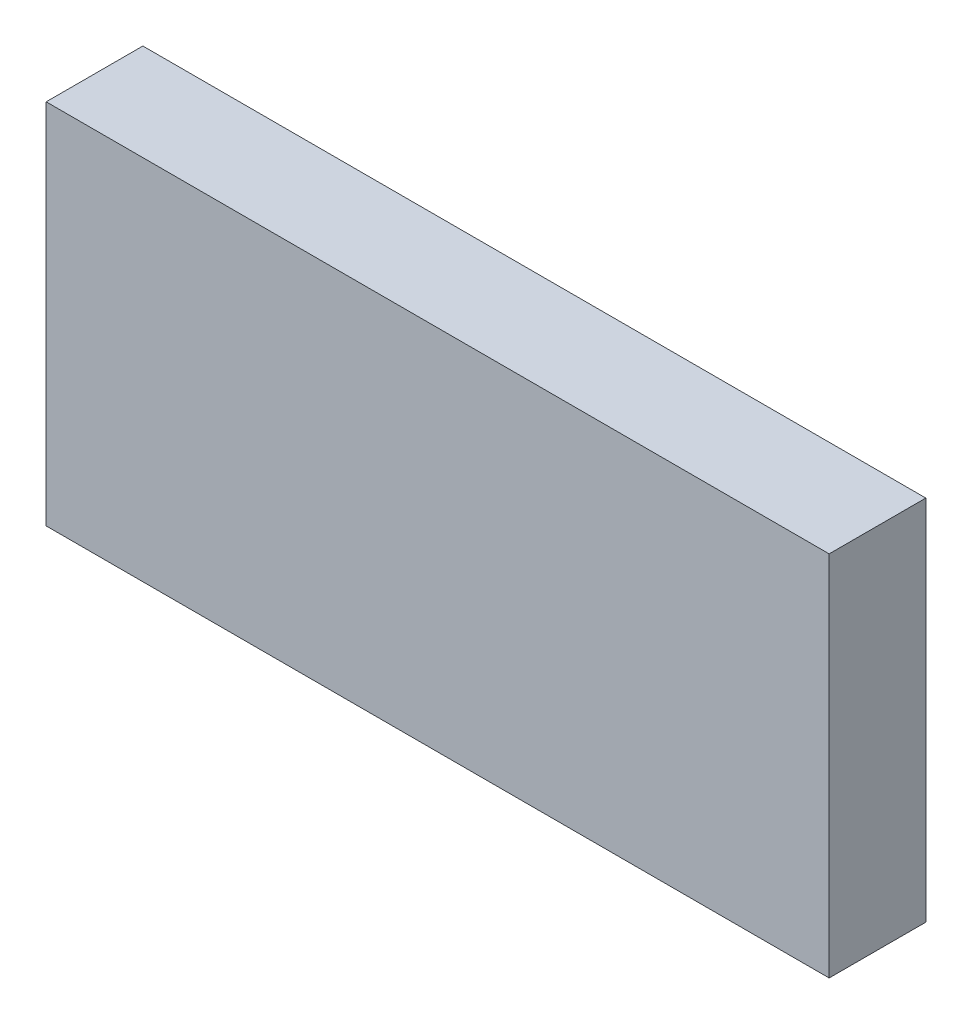
ISO-10303-21;
HEADER;
FILE_DESCRIPTION(('STEP AP214'),'2;1');
FILE_NAME('part.step','',(''),(''),'','','');
FILE_SCHEMA(('AUTOMOTIVE_DESIGN { 1 0 10303 214 1 1 1 1 }'));
ENDSEC;
DATA;
#1=APPLICATION_CONTEXT('core data for automotive mechanical design processes');
#2=APPLICATION_PROTOCOL_DEFINITION('international standard','automotive_design',2000,#1);
#3=PRODUCT_CONTEXT('',#1,'mechanical');
#4=PRODUCT('Part','Part','',(#3));
#5=PRODUCT_RELATED_PRODUCT_CATEGORY('part','',(#4));
#6=PRODUCT_DEFINITION_FORMATION('','',#4);
#7=PRODUCT_DEFINITION_CONTEXT('part definition',#1,'design');
#8=PRODUCT_DEFINITION('design','',#6,#7);
#9=PRODUCT_DEFINITION_SHAPE('','',#8);
#10=(LENGTH_UNIT() NAMED_UNIT(*) SI_UNIT(.MILLI.,.METRE.));
#11=(NAMED_UNIT(*) PLANE_ANGLE_UNIT() SI_UNIT($,.RADIAN.));
#12=(NAMED_UNIT(*) SI_UNIT($,.STERADIAN.) SOLID_ANGLE_UNIT());
#13=UNCERTAINTY_MEASURE_WITH_UNIT(LENGTH_MEASURE(1.E-05),#10,'distance_accuracy_value','');
#14=(GEOMETRIC_REPRESENTATION_CONTEXT(3) GLOBAL_UNCERTAINTY_ASSIGNED_CONTEXT((#13)) GLOBAL_UNIT_ASSIGNED_CONTEXT((#10,
#11,#12)) REPRESENTATION_CONTEXT('',''));
#15=CARTESIAN_POINT('',(0.,0.,0.));
#16=DIRECTION('',(0.,0.,1.));
#17=DIRECTION('',(1.,0.,0.));
#18=AXIS2_PLACEMENT_3D('',#15,#16,#17);
#19=CARTESIAN_POINT('',(-1.62,0.,0.2));
#20=DIRECTION('',(0.,0.,1.));
#21=DIRECTION('',(1.,0.,0.));
#22=AXIS2_PLACEMENT_3D('',#19,#20,#21);
#23=PLANE('',#22);
#24=DIRECTION('',(0.,1.,0.));
#25=VECTOR('',#24,1.);
#26=CARTESIAN_POINT('',(0.,0.,0.2));
#27=LINE('',#26,#25);
#28=CARTESIAN_POINT('',(0.,0.76,0.2));
#29=VERTEX_POINT('',#28);
#30=CARTESIAN_POINT('',(0.,0.,0.2));
#31=VERTEX_POINT('',#30);
#32=EDGE_CURVE('E76',#29,#31,#27,.F.);
#33=ORIENTED_EDGE('',*,*,#32,.F.);
#34=DIRECTION('',(1.,0.,0.));
#35=VECTOR('',#34,1.);
#36=CARTESIAN_POINT('',(-1.62,0.76,0.2));
#37=LINE('',#36,#35);
#38=CARTESIAN_POINT('',(-1.62,0.76,0.2));
#39=VERTEX_POINT('',#38);
#40=EDGE_CURVE('E58',#39,#29,#37,.T.);
#41=ORIENTED_EDGE('',*,*,#40,.F.);
#42=DIRECTION('',(0.,1.,0.));
#43=VECTOR('',#42,1.);
#44=CARTESIAN_POINT('',(-1.62,0.,0.2));
#45=LINE('',#44,#43);
#46=CARTESIAN_POINT('',(-1.62,0.,0.2));
#47=VERTEX_POINT('',#46);
#48=EDGE_CURVE('E20',#39,#47,#45,.F.);
#49=ORIENTED_EDGE('',*,*,#48,.T.);
#50=DIRECTION('',(1.,0.,0.));
#51=VECTOR('',#50,1.);
#52=CARTESIAN_POINT('',(-1.62,0.,0.2));
#53=LINE('',#52,#51);
#54=EDGE_CURVE('E55',#47,#31,#53,.T.);
#55=ORIENTED_EDGE('',*,*,#54,.T.);
#56=EDGE_LOOP('',(#33,#41,#49,#55));
#57=FACE_BOUND('',#56,.T.);
#58=ADVANCED_FACE('F17',(#57),#23,.T.);
#59=CARTESIAN_POINT('',(-1.62,0.,0.));
#60=DIRECTION('',(1.,0.,0.));
#61=DIRECTION('',(0.,0.,-1.));
#62=AXIS2_PLACEMENT_3D('',#59,#60,#61);
#63=PLANE('',#62);
#64=DIRECTION('',(0.,0.,1.));
#65=VECTOR('',#64,1.);
#66=CARTESIAN_POINT('',(-1.62,0.76,0.));
#67=LINE('',#66,#65);
#68=CARTESIAN_POINT('',(-1.62,0.76,0.));
#69=VERTEX_POINT('',#68);
#70=EDGE_CURVE('E78',#69,#39,#67,.T.);
#71=ORIENTED_EDGE('',*,*,#70,.F.);
#72=DIRECTION('',(0.,1.,0.));
#73=VECTOR('',#72,1.);
#74=CARTESIAN_POINT('',(-1.62,0.,0.));
#75=LINE('',#74,#73);
#76=CARTESIAN_POINT('',(-1.62,0.,0.));
#77=VERTEX_POINT('',#76);
#78=EDGE_CURVE('E73',#69,#77,#75,.F.);
#79=ORIENTED_EDGE('',*,*,#78,.T.);
#80=DIRECTION('',(0.,0.,1.));
#81=VECTOR('',#80,1.);
#82=CARTESIAN_POINT('',(-1.62,0.,0.));
#83=LINE('',#82,#81);
#84=EDGE_CURVE('E63',#77,#47,#83,.T.);
#85=ORIENTED_EDGE('',*,*,#84,.T.);
#86=ORIENTED_EDGE('',*,*,#48,.F.);
#87=EDGE_LOOP('',(#71,#79,#85,#86));
#88=FACE_BOUND('',#87,.T.);
#89=ADVANCED_FACE('F72',(#88),#63,.F.);
#90=CARTESIAN_POINT('',(-1.62,0.,0.));
#91=DIRECTION('',(0.,1.,0.));
#92=DIRECTION('',(0.,0.,1.));
#93=AXIS2_PLACEMENT_3D('',#90,#91,#92);
#94=PLANE('',#93);
#95=ORIENTED_EDGE('',*,*,#54,.F.);
#96=ORIENTED_EDGE('',*,*,#84,.F.);
#97=DIRECTION('',(1.,0.,0.));
#98=VECTOR('',#97,1.);
#99=CARTESIAN_POINT('',(-1.62,0.,0.));
#100=LINE('',#99,#98);
#101=CARTESIAN_POINT('',(0.,0.,0.));
#102=VERTEX_POINT('',#101);
#103=EDGE_CURVE('E83',#77,#102,#100,.T.);
#104=ORIENTED_EDGE('',*,*,#103,.T.);
#105=DIRECTION('',(0.,0.,-1.));
#106=VECTOR('',#105,1.);
#107=CARTESIAN_POINT('',(0.,0.,0.));
#108=LINE('',#107,#106);
#109=EDGE_CURVE('E69',#31,#102,#108,.T.);
#110=ORIENTED_EDGE('',*,*,#109,.F.);
#111=EDGE_LOOP('',(#95,#96,#104,#110));
#112=FACE_BOUND('',#111,.T.);
#113=ADVANCED_FACE('F66',(#112),#94,.F.);
#114=CARTESIAN_POINT('',(0.,0.,0.));
#115=DIRECTION('',(1.,0.,0.));
#116=DIRECTION('',(0.,0.,-1.));
#117=AXIS2_PLACEMENT_3D('',#114,#115,#116);
#118=PLANE('',#117);
#119=DIRECTION('',(0.,0.,1.));
#120=VECTOR('',#119,1.);
#121=CARTESIAN_POINT('',(0.,0.76,0.));
#122=LINE('',#121,#120);
#123=CARTESIAN_POINT('',(0.,0.76,0.));
#124=VERTEX_POINT('',#123);
#125=EDGE_CURVE('E34',#29,#124,#122,.F.);
#126=ORIENTED_EDGE('',*,*,#125,.F.);
#127=ORIENTED_EDGE('',*,*,#32,.T.);
#128=ORIENTED_EDGE('',*,*,#109,.T.);
#129=DIRECTION('',(0.,1.,0.));
#130=VECTOR('',#129,1.);
#131=CARTESIAN_POINT('',(0.,0.,0.));
#132=LINE('',#131,#130);
#133=EDGE_CURVE('E26',#102,#124,#132,.T.);
#134=ORIENTED_EDGE('',*,*,#133,.T.);
#135=EDGE_LOOP('',(#126,#127,#128,#134));
#136=FACE_BOUND('',#135,.T.);
#137=ADVANCED_FACE('F88',(#136),#118,.T.);
#138=CARTESIAN_POINT('',(-1.62,0.76,0.));
#139=DIRECTION('',(0.,1.,0.));
#140=DIRECTION('',(0.,0.,1.));
#141=AXIS2_PLACEMENT_3D('',#138,#139,#140);
#142=PLANE('',#141);
#143=ORIENTED_EDGE('',*,*,#40,.T.);
#144=ORIENTED_EDGE('',*,*,#125,.T.);
#145=DIRECTION('',(1.,0.,0.));
#146=VECTOR('',#145,1.);
#147=CARTESIAN_POINT('',(-1.62,0.76,0.));
#148=LINE('',#147,#146);
#149=EDGE_CURVE('E11',#124,#69,#148,.F.);
#150=ORIENTED_EDGE('',*,*,#149,.T.);
#151=ORIENTED_EDGE('',*,*,#70,.T.);
#152=EDGE_LOOP('',(#143,#144,#150,#151));
#153=FACE_BOUND('',#152,.T.);
#154=ADVANCED_FACE('F91',(#153),#142,.T.);
#155=CARTESIAN_POINT('',(-1.62,0.,0.));
#156=DIRECTION('',(0.,0.,1.));
#157=DIRECTION('',(1.,0.,0.));
#158=AXIS2_PLACEMENT_3D('',#155,#156,#157);
#159=PLANE('',#158);
#160=ORIENTED_EDGE('',*,*,#133,.F.);
#161=ORIENTED_EDGE('',*,*,#103,.F.);
#162=ORIENTED_EDGE('',*,*,#78,.F.);
#163=ORIENTED_EDGE('',*,*,#149,.F.);
#164=EDGE_LOOP('',(#160,#161,#162,#163));
#165=FACE_BOUND('',#164,.T.);
#166=ADVANCED_FACE('F90',(#165),#159,.F.);
#167=CLOSED_SHELL('',(#58,#89,#113,#137,#154,#166));
#168=MANIFOLD_SOLID_BREP('B1',#167);
#169=ADVANCED_BREP_SHAPE_REPRESENTATION('',(#18,#168),#14);
#170=SHAPE_DEFINITION_REPRESENTATION(#9,#169);
ENDSEC;
END-ISO-10303-21;
